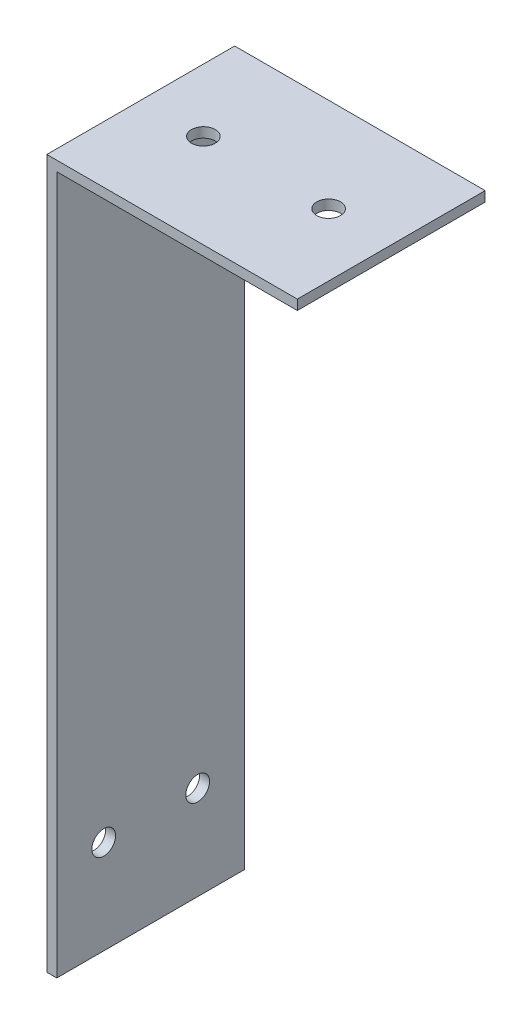
ISO-10303-21;
HEADER;
FILE_DESCRIPTION(('STEP AP214'),'2;1');
FILE_NAME('part.step','',(''),(''),'','','');
FILE_SCHEMA(('AUTOMOTIVE_DESIGN { 1 0 10303 214 1 1 1 1 }'));
ENDSEC;
DATA;
#1=APPLICATION_CONTEXT('core data for automotive mechanical design processes');
#2=APPLICATION_PROTOCOL_DEFINITION('international standard','automotive_design',2000,#1);
#3=PRODUCT_CONTEXT('',#1,'mechanical');
#4=PRODUCT('Part','Part','',(#3));
#5=PRODUCT_RELATED_PRODUCT_CATEGORY('part','',(#4));
#6=PRODUCT_DEFINITION_FORMATION('','',#4);
#7=PRODUCT_DEFINITION_CONTEXT('part definition',#1,'design');
#8=PRODUCT_DEFINITION('design','',#6,#7);
#9=PRODUCT_DEFINITION_SHAPE('','',#8);
#10=(LENGTH_UNIT() NAMED_UNIT(*) SI_UNIT(.MILLI.,.METRE.));
#11=(NAMED_UNIT(*) PLANE_ANGLE_UNIT() SI_UNIT($,.RADIAN.));
#12=(NAMED_UNIT(*) SI_UNIT($,.STERADIAN.) SOLID_ANGLE_UNIT());
#13=UNCERTAINTY_MEASURE_WITH_UNIT(LENGTH_MEASURE(1.E-05),#10,'distance_accuracy_value','');
#14=(GEOMETRIC_REPRESENTATION_CONTEXT(3) GLOBAL_UNCERTAINTY_ASSIGNED_CONTEXT((#13)) GLOBAL_UNIT_ASSIGNED_CONTEXT((#10,
#11,#12)) REPRESENTATION_CONTEXT('',''));
#15=CARTESIAN_POINT('',(0.,0.,0.));
#16=DIRECTION('',(0.,0.,1.));
#17=DIRECTION('',(1.,0.,0.));
#18=AXIS2_PLACEMENT_3D('',#15,#16,#17);
#19=CARTESIAN_POINT('',(1.5875,0.,15.));
#20=DIRECTION('',(0.,1.,0.));
#21=DIRECTION('',(0.,0.,1.));
#22=AXIS2_PLACEMENT_3D('',#19,#20,#21);
#23=PLANE('',#22);
#24=DIRECTION('',(1.,0.,0.));
#25=VECTOR('',#24,1.);
#26=CARTESIAN_POINT('',(1.5875,0.,-15.));
#27=LINE('',#26,#25);
#28=CARTESIAN_POINT('',(0.,0.,-15.));
#29=VERTEX_POINT('',#28);
#30=CARTESIAN_POINT('',(1.5875,0.,-15.));
#31=VERTEX_POINT('',#30);
#32=EDGE_CURVE('E119',#29,#31,#27,.T.);
#33=ORIENTED_EDGE('',*,*,#32,.T.);
#34=DIRECTION('',(0.,0.,-1.));
#35=VECTOR('',#34,1.);
#36=CARTESIAN_POINT('',(1.5875,0.,15.));
#37=LINE('',#36,#35);
#38=CARTESIAN_POINT('',(1.5875,0.,15.));
#39=VERTEX_POINT('',#38);
#40=EDGE_CURVE('E11',#39,#31,#37,.T.);
#41=ORIENTED_EDGE('',*,*,#40,.F.);
#42=DIRECTION('',(1.,0.,0.));
#43=VECTOR('',#42,1.);
#44=CARTESIAN_POINT('',(1.5875,0.,15.));
#45=LINE('',#44,#43);
#46=CARTESIAN_POINT('',(0.,0.,15.));
#47=VERTEX_POINT('',#46);
#48=EDGE_CURVE('E130',#47,#39,#45,.T.);
#49=ORIENTED_EDGE('',*,*,#48,.F.);
#50=DIRECTION('',(0.,0.,-1.));
#51=VECTOR('',#50,1.);
#52=CARTESIAN_POINT('',(0.,0.,15.));
#53=LINE('',#52,#51);
#54=EDGE_CURVE('E115',#47,#29,#53,.T.);
#55=ORIENTED_EDGE('',*,*,#54,.T.);
#56=EDGE_LOOP('',(#33,#41,#49,#55));
#57=FACE_BOUND('',#56,.T.);
#58=ADVANCED_FACE('F35',(#57),#23,.F.);
#59=CARTESIAN_POINT('',(1.5875,0.,15.));
#60=DIRECTION('',(-1.,0.,0.));
#61=DIRECTION('',(0.,0.,1.));
#62=AXIS2_PLACEMENT_3D('',#59,#60,#61);
#63=PLANE('',#62);
#64=CARTESIAN_POINT('',(1.5875,15.,-7.5));
#65=DIRECTION('',(-1.,0.,0.));
#66=DIRECTION('',(0.,0.,1.));
#67=AXIS2_PLACEMENT_3D('',#64,#65,#66);
#68=CIRCLE('',#67,1.89864999999999);
#69=CARTESIAN_POINT('',(1.5875,15.,-5.60135000000001));
#70=VERTEX_POINT('',#69);
#71=EDGE_CURVE('E264',#70,#70,#68,.T.);
#72=ORIENTED_EDGE('',*,*,#71,.T.);
#73=EDGE_LOOP('',(#72));
#74=FACE_BOUND('',#73,.T.);
#75=CARTESIAN_POINT('',(1.5875,15.,7.5));
#76=DIRECTION('',(-1.,0.,0.));
#77=DIRECTION('',(0.,0.,1.));
#78=AXIS2_PLACEMENT_3D('',#75,#76,#77);
#79=CIRCLE('',#78,1.89864999999999);
#80=CARTESIAN_POINT('',(1.5875,15.,9.39864999999999));
#81=VERTEX_POINT('',#80);
#82=EDGE_CURVE('E123',#81,#81,#79,.T.);
#83=ORIENTED_EDGE('',*,*,#82,.T.);
#84=EDGE_LOOP('',(#83));
#85=FACE_BOUND('',#84,.T.);
#86=DIRECTION('',(0.,1.,0.));
#87=VECTOR('',#86,1.);
#88=CARTESIAN_POINT('',(1.5875,0.,-15.));
#89=LINE('',#88,#87);
#90=CARTESIAN_POINT('',(1.5875,111.5125,-15.));
#91=VERTEX_POINT('',#90);
#92=EDGE_CURVE('E122',#31,#91,#89,.T.);
#93=ORIENTED_EDGE('',*,*,#92,.T.);
#94=DIRECTION('',(0.,0.,-1.));
#95=VECTOR('',#94,1.);
#96=CARTESIAN_POINT('',(1.5875,111.5125,15.));
#97=LINE('',#96,#95);
#98=CARTESIAN_POINT('',(1.5875,111.5125,15.));
#99=VERTEX_POINT('',#98);
#100=EDGE_CURVE('E43',#99,#91,#97,.T.);
#101=ORIENTED_EDGE('',*,*,#100,.F.);
#102=DIRECTION('',(0.,1.,0.));
#103=VECTOR('',#102,1.);
#104=CARTESIAN_POINT('',(1.5875,0.,15.));
#105=LINE('',#104,#103);
#106=EDGE_CURVE('E88',#39,#99,#105,.T.);
#107=ORIENTED_EDGE('',*,*,#106,.F.);
#108=ORIENTED_EDGE('',*,*,#40,.T.);
#109=EDGE_LOOP('',(#93,#101,#107,#108));
#110=FACE_BOUND('',#109,.T.);
#111=ADVANCED_FACE('F158',(#74,#85,#110),#63,.F.);
#112=CARTESIAN_POINT('',(1.5875,111.5125,15.));
#113=DIRECTION('',(0.,1.,0.));
#114=DIRECTION('',(0.,0.,1.));
#115=AXIS2_PLACEMENT_3D('',#112,#113,#114);
#116=PLANE('',#115);
#117=CARTESIAN_POINT('',(10.,111.5125,0.));
#118=DIRECTION('',(0.,1.,0.));
#119=DIRECTION('',(0.,0.,1.));
#120=AXIS2_PLACEMENT_3D('',#117,#118,#119);
#121=CIRCLE('',#120,1.89864999999999);
#122=CARTESIAN_POINT('',(10.,111.5125,1.89864999999999));
#123=VERTEX_POINT('',#122);
#124=EDGE_CURVE('E277',#123,#123,#121,.F.);
#125=ORIENTED_EDGE('',*,*,#124,.F.);
#126=EDGE_LOOP('',(#125));
#127=FACE_BOUND('',#126,.T.);
#128=CARTESIAN_POINT('',(30.,111.5125,0.));
#129=DIRECTION('',(0.,1.,0.));
#130=DIRECTION('',(0.,0.,1.));
#131=AXIS2_PLACEMENT_3D('',#128,#129,#130);
#132=CIRCLE('',#131,1.89864999999999);
#133=CARTESIAN_POINT('',(30.,111.5125,1.89864999999999));
#134=VERTEX_POINT('',#133);
#135=EDGE_CURVE('E273',#134,#134,#132,.F.);
#136=ORIENTED_EDGE('',*,*,#135,.F.);
#137=EDGE_LOOP('',(#136));
#138=FACE_BOUND('',#137,.T.);
#139=DIRECTION('',(1.,0.,0.));
#140=VECTOR('',#139,1.);
#141=CARTESIAN_POINT('',(1.5875,111.5125,-15.));
#142=LINE('',#141,#140);
#143=CARTESIAN_POINT('',(40.,111.5125,-15.));
#144=VERTEX_POINT('',#143);
#145=EDGE_CURVE('E125',#91,#144,#142,.T.);
#146=ORIENTED_EDGE('',*,*,#145,.T.);
#147=DIRECTION('',(0.,0.,-1.));
#148=VECTOR('',#147,1.);
#149=CARTESIAN_POINT('',(40.,111.5125,15.));
#150=LINE('',#149,#148);
#151=CARTESIAN_POINT('',(40.,111.5125,15.));
#152=VERTEX_POINT('',#151);
#153=EDGE_CURVE('E110',#152,#144,#150,.T.);
#154=ORIENTED_EDGE('',*,*,#153,.F.);
#155=DIRECTION('',(1.,0.,0.));
#156=VECTOR('',#155,1.);
#157=CARTESIAN_POINT('',(1.5875,111.5125,15.));
#158=LINE('',#157,#156);
#159=EDGE_CURVE('E101',#99,#152,#158,.T.);
#160=ORIENTED_EDGE('',*,*,#159,.F.);
#161=ORIENTED_EDGE('',*,*,#100,.T.);
#162=EDGE_LOOP('',(#146,#154,#160,#161));
#163=FACE_BOUND('',#162,.T.);
#164=ADVANCED_FACE('F136',(#127,#138,#163),#116,.F.);
#165=CARTESIAN_POINT('',(40.,113.1,15.));
#166=DIRECTION('',(-1.,0.,0.));
#167=DIRECTION('',(0.,0.,1.));
#168=AXIS2_PLACEMENT_3D('',#165,#166,#167);
#169=PLANE('',#168);
#170=DIRECTION('',(0.,1.,0.));
#171=VECTOR('',#170,1.);
#172=CARTESIAN_POINT('',(40.,113.1,-15.));
#173=LINE('',#172,#171);
#174=CARTESIAN_POINT('',(40.,113.1,-15.));
#175=VERTEX_POINT('',#174);
#176=EDGE_CURVE('E109',#144,#175,#173,.T.);
#177=ORIENTED_EDGE('',*,*,#176,.T.);
#178=DIRECTION('',(0.,0.,-1.));
#179=VECTOR('',#178,1.);
#180=CARTESIAN_POINT('',(40.,113.1,15.));
#181=LINE('',#180,#179);
#182=CARTESIAN_POINT('',(40.,113.1,15.));
#183=VERTEX_POINT('',#182);
#184=EDGE_CURVE('E106',#183,#175,#181,.T.);
#185=ORIENTED_EDGE('',*,*,#184,.F.);
#186=DIRECTION('',(0.,1.,0.));
#187=VECTOR('',#186,1.);
#188=CARTESIAN_POINT('',(40.,113.1,15.));
#189=LINE('',#188,#187);
#190=EDGE_CURVE('E95',#152,#183,#189,.T.);
#191=ORIENTED_EDGE('',*,*,#190,.F.);
#192=ORIENTED_EDGE('',*,*,#153,.T.);
#193=EDGE_LOOP('',(#177,#185,#191,#192));
#194=FACE_BOUND('',#193,.T.);
#195=ADVANCED_FACE('F107',(#194),#169,.F.);
#196=CARTESIAN_POINT('',(0.,113.1,15.));
#197=DIRECTION('',(0.,-1.,0.));
#198=DIRECTION('',(0.,0.,-1.));
#199=AXIS2_PLACEMENT_3D('',#196,#197,#198);
#200=PLANE('',#199);
#201=CARTESIAN_POINT('',(10.,113.1,0.));
#202=DIRECTION('',(0.,1.,0.));
#203=DIRECTION('',(0.,0.,1.));
#204=AXIS2_PLACEMENT_3D('',#201,#202,#203);
#205=CIRCLE('',#204,1.89864999999999);
#206=CARTESIAN_POINT('',(10.,113.1,1.89864999999999));
#207=VERTEX_POINT('',#206);
#208=EDGE_CURVE('E280',#207,#207,#205,.T.);
#209=ORIENTED_EDGE('',*,*,#208,.F.);
#210=EDGE_LOOP('',(#209));
#211=FACE_BOUND('',#210,.T.);
#212=CARTESIAN_POINT('',(30.,113.1,0.));
#213=DIRECTION('',(0.,1.,0.));
#214=DIRECTION('',(0.,0.,1.));
#215=AXIS2_PLACEMENT_3D('',#212,#213,#214);
#216=CIRCLE('',#215,1.89864999999999);
#217=CARTESIAN_POINT('',(30.,113.1,1.89864999999999));
#218=VERTEX_POINT('',#217);
#219=EDGE_CURVE('E274',#218,#218,#216,.T.);
#220=ORIENTED_EDGE('',*,*,#219,.F.);
#221=EDGE_LOOP('',(#220));
#222=FACE_BOUND('',#221,.T.);
#223=DIRECTION('',(-1.,0.,0.));
#224=VECTOR('',#223,1.);
#225=CARTESIAN_POINT('',(0.,113.1,-15.));
#226=LINE('',#225,#224);
#227=CARTESIAN_POINT('',(0.,113.1,-15.));
#228=VERTEX_POINT('',#227);
#229=EDGE_CURVE('E74',#175,#228,#226,.T.);
#230=ORIENTED_EDGE('',*,*,#229,.T.);
#231=DIRECTION('',(0.,0.,-1.));
#232=VECTOR('',#231,1.);
#233=CARTESIAN_POINT('',(0.,113.1,15.));
#234=LINE('',#233,#232);
#235=CARTESIAN_POINT('',(0.,113.1,15.));
#236=VERTEX_POINT('',#235);
#237=EDGE_CURVE('E111',#236,#228,#234,.T.);
#238=ORIENTED_EDGE('',*,*,#237,.F.);
#239=DIRECTION('',(-1.,0.,0.));
#240=VECTOR('',#239,1.);
#241=CARTESIAN_POINT('',(0.,113.1,15.));
#242=LINE('',#241,#240);
#243=EDGE_CURVE('E99',#183,#236,#242,.T.);
#244=ORIENTED_EDGE('',*,*,#243,.F.);
#245=ORIENTED_EDGE('',*,*,#184,.T.);
#246=EDGE_LOOP('',(#230,#238,#244,#245));
#247=FACE_BOUND('',#246,.T.);
#248=ADVANCED_FACE('F113',(#211,#222,#247),#200,.F.);
#249=CARTESIAN_POINT('',(0.,0.,15.));
#250=DIRECTION('',(1.,0.,0.));
#251=DIRECTION('',(0.,0.,-1.));
#252=AXIS2_PLACEMENT_3D('',#249,#250,#251);
#253=PLANE('',#252);
#254=CARTESIAN_POINT('',(0.,15.,-7.5));
#255=DIRECTION('',(-1.,0.,0.));
#256=DIRECTION('',(0.,0.,1.));
#257=AXIS2_PLACEMENT_3D('',#254,#255,#256);
#258=CIRCLE('',#257,1.89864999999999);
#259=CARTESIAN_POINT('',(0.,15.,-5.60135000000001));
#260=VERTEX_POINT('',#259);
#261=EDGE_CURVE('E270',#260,#260,#258,.T.);
#262=ORIENTED_EDGE('',*,*,#261,.F.);
#263=EDGE_LOOP('',(#262));
#264=FACE_BOUND('',#263,.T.);
#265=CARTESIAN_POINT('',(0.,15.,7.5));
#266=DIRECTION('',(-1.,0.,0.));
#267=DIRECTION('',(0.,0.,1.));
#268=AXIS2_PLACEMENT_3D('',#265,#266,#267);
#269=CIRCLE('',#268,1.89864999999999);
#270=CARTESIAN_POINT('',(0.,15.,9.39864999999999));
#271=VERTEX_POINT('',#270);
#272=EDGE_CURVE('E260',#271,#271,#269,.T.);
#273=ORIENTED_EDGE('',*,*,#272,.F.);
#274=EDGE_LOOP('',(#273));
#275=FACE_BOUND('',#274,.T.);
#276=DIRECTION('',(0.,-1.,0.));
#277=VECTOR('',#276,1.);
#278=CARTESIAN_POINT('',(0.,0.,-15.));
#279=LINE('',#278,#277);
#280=EDGE_CURVE('E80',#228,#29,#279,.T.);
#281=ORIENTED_EDGE('',*,*,#280,.T.);
#282=ORIENTED_EDGE('',*,*,#54,.F.);
#283=DIRECTION('',(0.,-1.,0.));
#284=VECTOR('',#283,1.);
#285=CARTESIAN_POINT('',(0.,0.,15.));
#286=LINE('',#285,#284);
#287=EDGE_CURVE('E51',#236,#47,#286,.T.);
#288=ORIENTED_EDGE('',*,*,#287,.F.);
#289=ORIENTED_EDGE('',*,*,#237,.T.);
#290=EDGE_LOOP('',(#281,#282,#288,#289));
#291=FACE_BOUND('',#290,.T.);
#292=ADVANCED_FACE('F143',(#264,#275,#291),#253,.F.);
#293=CARTESIAN_POINT('',(0.,0.,15.));
#294=DIRECTION('',(0.,0.,-1.));
#295=DIRECTION('',(-1.,0.,0.));
#296=AXIS2_PLACEMENT_3D('',#293,#294,#295);
#297=PLANE('',#296);
#298=ORIENTED_EDGE('',*,*,#48,.T.);
#299=ORIENTED_EDGE('',*,*,#106,.T.);
#300=ORIENTED_EDGE('',*,*,#159,.T.);
#301=ORIENTED_EDGE('',*,*,#190,.T.);
#302=ORIENTED_EDGE('',*,*,#243,.T.);
#303=ORIENTED_EDGE('',*,*,#287,.T.);
#304=EDGE_LOOP('',(#298,#299,#300,#301,#302,#303));
#305=FACE_BOUND('',#304,.T.);
#306=ADVANCED_FACE('F97',(#305),#297,.F.);
#307=CARTESIAN_POINT('',(0.,0.,-15.));
#308=DIRECTION('',(0.,0.,-1.));
#309=DIRECTION('',(-1.,0.,0.));
#310=AXIS2_PLACEMENT_3D('',#307,#308,#309);
#311=PLANE('',#310);
#312=ORIENTED_EDGE('',*,*,#32,.F.);
#313=ORIENTED_EDGE('',*,*,#280,.F.);
#314=ORIENTED_EDGE('',*,*,#229,.F.);
#315=ORIENTED_EDGE('',*,*,#176,.F.);
#316=ORIENTED_EDGE('',*,*,#145,.F.);
#317=ORIENTED_EDGE('',*,*,#92,.F.);
#318=EDGE_LOOP('',(#312,#313,#314,#315,#316,#317));
#319=FACE_BOUND('',#318,.T.);
#320=ADVANCED_FACE('F139',(#319),#311,.T.);
#321=CARTESIAN_POINT('',(0.,15.,7.5));
#322=DIRECTION('',(-1.,0.,0.));
#323=DIRECTION('',(0.,0.,1.));
#324=AXIS2_PLACEMENT_3D('',#321,#322,#323);
#325=CYLINDRICAL_SURFACE('',#324,1.89864999999999);
#326=ORIENTED_EDGE('',*,*,#272,.T.);
#327=EDGE_LOOP('',(#326));
#328=FACE_BOUND('',#327,.T.);
#329=ORIENTED_EDGE('',*,*,#82,.F.);
#330=EDGE_LOOP('',(#329));
#331=FACE_BOUND('',#330,.T.);
#332=ADVANCED_FACE('F216',(#328,#331),#325,.F.);
#333=CARTESIAN_POINT('',(0.,15.,-7.5));
#334=DIRECTION('',(-1.,0.,0.));
#335=DIRECTION('',(0.,0.,1.));
#336=AXIS2_PLACEMENT_3D('',#333,#334,#335);
#337=CYLINDRICAL_SURFACE('',#336,1.89864999999999);
#338=ORIENTED_EDGE('',*,*,#261,.T.);
#339=EDGE_LOOP('',(#338));
#340=FACE_BOUND('',#339,.T.);
#341=ORIENTED_EDGE('',*,*,#71,.F.);
#342=EDGE_LOOP('',(#341));
#343=FACE_BOUND('',#342,.T.);
#344=ADVANCED_FACE('F196',(#340,#343),#337,.F.);
#345=CARTESIAN_POINT('',(30.,113.1,0.));
#346=DIRECTION('',(0.,1.,0.));
#347=DIRECTION('',(0.,0.,1.));
#348=AXIS2_PLACEMENT_3D('',#345,#346,#347);
#349=CYLINDRICAL_SURFACE('',#348,1.89864999999999);
#350=ORIENTED_EDGE('',*,*,#135,.T.);
#351=EDGE_LOOP('',(#350));
#352=FACE_BOUND('',#351,.T.);
#353=ORIENTED_EDGE('',*,*,#219,.T.);
#354=EDGE_LOOP('',(#353));
#355=FACE_BOUND('',#354,.T.);
#356=ADVANCED_FACE('F190',(#352,#355),#349,.F.);
#357=CARTESIAN_POINT('',(10.,113.1,0.));
#358=DIRECTION('',(0.,1.,0.));
#359=DIRECTION('',(0.,0.,1.));
#360=AXIS2_PLACEMENT_3D('',#357,#358,#359);
#361=CYLINDRICAL_SURFACE('',#360,1.89864999999999);
#362=ORIENTED_EDGE('',*,*,#124,.T.);
#363=EDGE_LOOP('',(#362));
#364=FACE_BOUND('',#363,.T.);
#365=ORIENTED_EDGE('',*,*,#208,.T.);
#366=EDGE_LOOP('',(#365));
#367=FACE_BOUND('',#366,.T.);
#368=ADVANCED_FACE('F195',(#364,#367),#361,.F.);
#369=CLOSED_SHELL('',(#58,#111,#164,#195,#248,#292,#306,#320,#332,#344,#356,#368));
#370=MANIFOLD_SOLID_BREP('B2',#369);
#371=ADVANCED_BREP_SHAPE_REPRESENTATION('',(#18,#370),#14);
#372=SHAPE_DEFINITION_REPRESENTATION(#9,#371);
ENDSEC;
END-ISO-10303-21;
